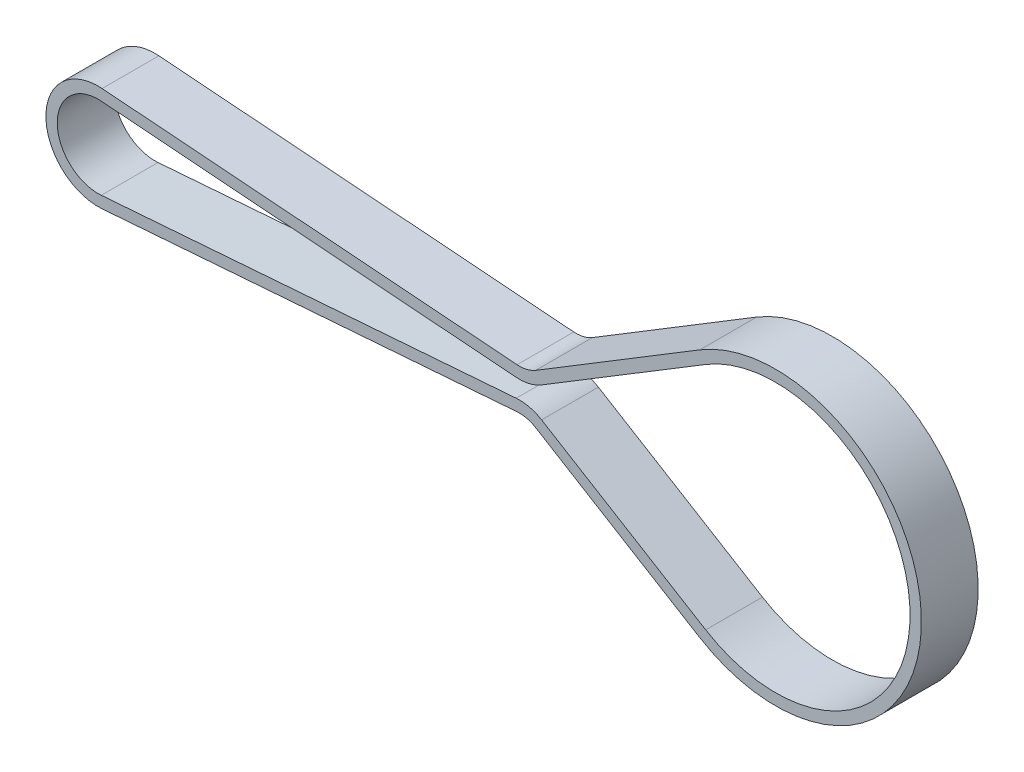
ISO-10303-21;
HEADER;
FILE_DESCRIPTION(('STEP AP214'),'2;1');
FILE_NAME('part.step','',(''),(''),'','','');
FILE_SCHEMA(('AUTOMOTIVE_DESIGN { 1 0 10303 214 1 1 1 1 }'));
ENDSEC;
DATA;
#1=APPLICATION_CONTEXT('core data for automotive mechanical design processes');
#2=APPLICATION_PROTOCOL_DEFINITION('international standard','automotive_design',2000,#1);
#3=PRODUCT_CONTEXT('',#1,'mechanical');
#4=PRODUCT('Part','Part','',(#3));
#5=PRODUCT_RELATED_PRODUCT_CATEGORY('part','',(#4));
#6=PRODUCT_DEFINITION_FORMATION('','',#4);
#7=PRODUCT_DEFINITION_CONTEXT('part definition',#1,'design');
#8=PRODUCT_DEFINITION('design','',#6,#7);
#9=PRODUCT_DEFINITION_SHAPE('','',#8);
#10=(LENGTH_UNIT() NAMED_UNIT(*) SI_UNIT(.MILLI.,.METRE.));
#11=(NAMED_UNIT(*) PLANE_ANGLE_UNIT() SI_UNIT($,.RADIAN.));
#12=(NAMED_UNIT(*) SI_UNIT($,.STERADIAN.) SOLID_ANGLE_UNIT());
#13=UNCERTAINTY_MEASURE_WITH_UNIT(LENGTH_MEASURE(1.E-05),#10,'distance_accuracy_value','');
#14=(GEOMETRIC_REPRESENTATION_CONTEXT(3) GLOBAL_UNCERTAINTY_ASSIGNED_CONTEXT((#13)) GLOBAL_UNIT_ASSIGNED_CONTEXT((#10,
#11,#12)) REPRESENTATION_CONTEXT('',''));
#15=CARTESIAN_POINT('',(0.,0.,0.));
#16=DIRECTION('',(0.,0.,1.));
#17=DIRECTION('',(1.,0.,0.));
#18=AXIS2_PLACEMENT_3D('',#15,#16,#17);
#19=CARTESIAN_POINT('',(0.,0.,184.33580348087));
#20=DIRECTION('',(0.,0.,-1.));
#21=DIRECTION('',(-1.,0.,0.));
#22=AXIS2_PLACEMENT_3D('',#19,#20,#21);
#23=CYLINDRICAL_SURFACE('',#22,10.125);
#24=DIRECTION('',(0.,0.,-1.));
#25=VECTOR('',#24,1.);
#26=CARTESIAN_POINT('',(0.771900540171762,-10.0955333963136,184.33580348087));
#27=LINE('',#26,#25);
#28=CARTESIAN_POINT('',(0.77190054017176,-10.0955333963136,5.50000000000009));
#29=VERTEX_POINT('',#28);
#30=CARTESIAN_POINT('',(0.771900540171774,-10.0955333963136,-5.49999999999994));
#31=VERTEX_POINT('',#30);
#32=EDGE_CURVE('E269',#29,#31,#27,.T.);
#33=ORIENTED_EDGE('',*,*,#32,.F.);
#34=CARTESIAN_POINT('',(0.,0.,5.50000000000009));
#35=DIRECTION('',(0.,0.,-1.));
#36=DIRECTION('',(-1.,0.,0.));
#37=AXIS2_PLACEMENT_3D('',#34,#35,#36);
#38=CIRCLE('',#37,10.125);
#39=CARTESIAN_POINT('',(0.771872033854974,10.0955355758549,5.50000000000009));
#40=VERTEX_POINT('',#39);
#41=EDGE_CURVE('E149',#29,#40,#38,.T.);
#42=ORIENTED_EDGE('',*,*,#41,.T.);
#43=DIRECTION('',(0.,0.,-1.));
#44=VECTOR('',#43,1.);
#45=CARTESIAN_POINT('',(0.771872033854974,10.0955355758549,184.33580348087));
#46=LINE('',#45,#44);
#47=CARTESIAN_POINT('',(0.771872033854974,10.0955355758549,-5.49999999999995));
#48=VERTEX_POINT('',#47);
#49=EDGE_CURVE('E281',#40,#48,#46,.T.);
#50=ORIENTED_EDGE('',*,*,#49,.T.);
#51=CARTESIAN_POINT('',(0.,0.,-5.49999999999995));
#52=DIRECTION('',(0.,0.,1.));
#53=DIRECTION('',(1.,0.,0.));
#54=AXIS2_PLACEMENT_3D('',#51,#52,#53);
#55=CIRCLE('',#54,10.125);
#56=EDGE_CURVE('E336',#31,#48,#55,.F.);
#57=ORIENTED_EDGE('',*,*,#56,.F.);
#58=EDGE_LOOP('',(#33,#42,#50,#57));
#59=FACE_BOUND('',#58,.T.);
#60=ADVANCED_FACE('F130',(#59),#23,.T.);
#61=CARTESIAN_POINT('',(81.178641225283,-3.94766541036326,184.33580348087));
#62=DIRECTION('',(-0.0762370903873346,0.997089718154426,0.));
#63=DIRECTION('',(-0.997089718154426,-0.0762370903873346,0.));
#64=AXIS2_PLACEMENT_3D('',#61,#62,#63);
#65=PLANE('',#64);
#66=DIRECTION('',(0.,0.,-1.));
#67=VECTOR('',#66,1.);
#68=CARTESIAN_POINT('',(81.178641225283,-3.94766541036326,184.33580348087));
#69=LINE('',#68,#67);
#70=CARTESIAN_POINT('',(81.178641225283,-3.94766541036326,5.50000000000006));
#71=VERTEX_POINT('',#70);
#72=CARTESIAN_POINT('',(81.178641225283,-3.94766541036326,-5.49999999999995));
#73=VERTEX_POINT('',#72);
#74=EDGE_CURVE('E229',#71,#73,#69,.T.);
#75=ORIENTED_EDGE('',*,*,#74,.F.);
#76=DIRECTION('',(-0.997089718154426,-0.0762370903873346,0.));
#77=VECTOR('',#76,1.);
#78=CARTESIAN_POINT('',(81.1786412252829,-3.94766541036327,5.50000000000006));
#79=LINE('',#78,#77);
#80=EDGE_CURVE('E272',#71,#29,#79,.T.);
#81=ORIENTED_EDGE('',*,*,#80,.T.);
#82=ORIENTED_EDGE('',*,*,#32,.T.);
#83=DIRECTION('',(-0.997089718154426,-0.0762370903873346,0.));
#84=VECTOR('',#83,1.);
#85=CARTESIAN_POINT('',(81.178641225283,-3.94766541036326,-5.49999999999998));
#86=LINE('',#85,#84);
#87=EDGE_CURVE('E304',#73,#31,#86,.T.);
#88=ORIENTED_EDGE('',*,*,#87,.F.);
#89=EDGE_LOOP('',(#75,#81,#82,#88));
#90=FACE_BOUND('',#89,.T.);
#91=ADVANCED_FACE('F408',(#90),#65,.F.);
#92=CARTESIAN_POINT('',(81.6414003639341,-9.99999999956063,184.33580348087));
#93=DIRECTION('',(0.,0.,-1.));
#94=DIRECTION('',(-1.,0.,0.));
#95=AXIS2_PLACEMENT_3D('',#92,#93,#94);
#96=CYLINDRICAL_SURFACE('',#95,6.07);
#97=DIRECTION('',(0.,0.,-1.));
#98=VECTOR('',#97,1.);
#99=CARTESIAN_POINT('',(84.7954679342819,-4.81379158091023,184.33580348087));
#100=LINE('',#99,#98);
#101=CARTESIAN_POINT('',(84.7954679342819,-4.81379158091023,5.50000000000007));
#102=VERTEX_POINT('',#101);
#103=CARTESIAN_POINT('',(84.7954679342819,-4.81379158091023,-5.49999999999998));
#104=VERTEX_POINT('',#103);
#105=EDGE_CURVE('E228',#102,#104,#100,.T.);
#106=ORIENTED_EDGE('',*,*,#105,.F.);
#107=CARTESIAN_POINT('',(81.6414003639341,-9.99999999956063,5.50000000000006));
#108=DIRECTION('',(0.,0.,-1.));
#109=DIRECTION('',(-1.,0.,0.));
#110=AXIS2_PLACEMENT_3D('',#107,#108,#109);
#111=CIRCLE('',#110,6.07);
#112=EDGE_CURVE('E224',#102,#71,#111,.F.);
#113=ORIENTED_EDGE('',*,*,#112,.T.);
#114=ORIENTED_EDGE('',*,*,#74,.T.);
#115=CARTESIAN_POINT('',(81.6414003639341,-9.99999999956063,-5.49999999999998));
#116=DIRECTION('',(0.,0.,1.));
#117=DIRECTION('',(1.,0.,0.));
#118=AXIS2_PLACEMENT_3D('',#115,#116,#117);
#119=CIRCLE('',#118,6.07);
#120=EDGE_CURVE('E313',#104,#73,#119,.T.);
#121=ORIENTED_EDGE('',*,*,#120,.F.);
#122=EDGE_LOOP('',(#106,#113,#114,#121));
#123=FACE_BOUND('',#122,.T.);
#124=ADVANCED_FACE('F307',(#123),#96,.F.);
#125=CARTESIAN_POINT('',(116.589214662106,-24.1496179494494,184.33580348087));
#126=DIRECTION('',(0.519615744703098,0.854400068970412,0.));
#127=DIRECTION('',(-0.854400068970412,0.519615744703098,0.));
#128=AXIS2_PLACEMENT_3D('',#125,#126,#127);
#129=PLANE('',#128);
#130=DIRECTION('',(0.,0.,-1.));
#131=VECTOR('',#130,1.);
#132=CARTESIAN_POINT('',(116.589214662106,-24.1496179494494,184.33580348087));
#133=LINE('',#132,#131);
#134=CARTESIAN_POINT('',(116.589214662106,-24.1496179494494,5.50000000000004));
#135=VERTEX_POINT('',#134);
#136=CARTESIAN_POINT('',(116.589214662106,-24.1496179494494,-5.49999999999998));
#137=VERTEX_POINT('',#136);
#138=EDGE_CURVE('E233',#135,#137,#133,.T.);
#139=ORIENTED_EDGE('',*,*,#138,.F.);
#140=DIRECTION('',(-0.854400068970412,0.519615744703098,0.));
#141=VECTOR('',#140,1.);
#142=CARTESIAN_POINT('',(116.589214662106,-24.1496179494494,5.50000000000006));
#143=LINE('',#142,#141);
#144=EDGE_CURVE('E218',#135,#102,#143,.T.);
#145=ORIENTED_EDGE('',*,*,#144,.T.);
#146=ORIENTED_EDGE('',*,*,#105,.T.);
#147=DIRECTION('',(-0.854400068970412,0.519615744703098,0.));
#148=VECTOR('',#147,1.);
#149=CARTESIAN_POINT('',(116.589214662106,-24.1496179494495,-5.49999999999998));
#150=LINE('',#149,#148);
#151=EDGE_CURVE('E237',#137,#104,#150,.T.);
#152=ORIENTED_EDGE('',*,*,#151,.F.);
#153=EDGE_LOOP('',(#139,#145,#146,#152));
#154=FACE_BOUND('',#153,.T.);
#155=ADVANCED_FACE('F234',(#154),#129,.F.);
#156=CARTESIAN_POINT('',(131.276153686139,-7.42461647718073E-13,184.33580348087));
#157=DIRECTION('',(0.,0.,-1.));
#158=DIRECTION('',(-1.,0.,0.));
#159=AXIS2_PLACEMENT_3D('',#156,#157,#158);
#160=CYLINDRICAL_SURFACE('',#159,28.265);
#161=DIRECTION('',(0.,0.,-1.));
#162=VECTOR('',#161,1.);
#163=CARTESIAN_POINT('',(116.589341289467,24.1496949592523,184.33580348087));
#164=LINE('',#163,#162);
#165=CARTESIAN_POINT('',(116.589341289467,24.1496949592523,5.50000000000004));
#166=VERTEX_POINT('',#165);
#167=CARTESIAN_POINT('',(116.589341289467,24.1496949592523,-5.50000000000001));
#168=VERTEX_POINT('',#167);
#169=EDGE_CURVE('E244',#166,#168,#164,.T.);
#170=ORIENTED_EDGE('',*,*,#169,.F.);
#171=CARTESIAN_POINT('',(131.276153686139,-7.42461647718073E-13,5.50000000000003));
#172=DIRECTION('',(0.,0.,-1.));
#173=DIRECTION('',(-1.,0.,0.));
#174=AXIS2_PLACEMENT_3D('',#171,#172,#173);
#175=CIRCLE('',#174,28.265);
#176=EDGE_CURVE('E221',#166,#135,#175,.T.);
#177=ORIENTED_EDGE('',*,*,#176,.T.);
#178=ORIENTED_EDGE('',*,*,#138,.T.);
#179=CARTESIAN_POINT('',(131.276153686139,-7.42461647718073E-13,-5.50000000000001));
#180=DIRECTION('',(0.,0.,1.));
#181=DIRECTION('',(1.,0.,0.));
#182=AXIS2_PLACEMENT_3D('',#179,#180,#181);
#183=CIRCLE('',#182,28.265);
#184=EDGE_CURVE('E323',#168,#137,#183,.F.);
#185=ORIENTED_EDGE('',*,*,#184,.F.);
#186=EDGE_LOOP('',(#170,#177,#178,#185));
#187=FACE_BOUND('',#186,.T.);
#188=ADVANCED_FACE('F242',(#187),#160,.T.);
#189=CARTESIAN_POINT('',(84.7954407409378,4.81400341107514,184.33580348087));
#190=DIRECTION('',(0.519611264697388,-0.854402793534513,0.));
#191=DIRECTION('',(0.854402793534514,0.519611264697388,0.));
#192=AXIS2_PLACEMENT_3D('',#189,#190,#191);
#193=PLANE('',#192);
#194=DIRECTION('',(0.,0.,-1.));
#195=VECTOR('',#194,1.);
#196=CARTESIAN_POINT('',(84.7954407409378,4.81400341107514,184.33580348087));
#197=LINE('',#196,#195);
#198=CARTESIAN_POINT('',(84.7954407409378,4.81400341107514,5.50000000000006));
#199=VERTEX_POINT('',#198);
#200=CARTESIAN_POINT('',(84.7954407409378,4.81400341107514,-5.49999999999998));
#201=VERTEX_POINT('',#200);
#202=EDGE_CURVE('E251',#199,#201,#197,.T.);
#203=ORIENTED_EDGE('',*,*,#202,.F.);
#204=DIRECTION('',(0.854402793534514,0.519611264697388,0.));
#205=VECTOR('',#204,1.);
#206=CARTESIAN_POINT('',(84.7954407409378,4.8140034110751,5.50000000000006));
#207=LINE('',#206,#205);
#208=EDGE_CURVE('E166',#199,#166,#207,.T.);
#209=ORIENTED_EDGE('',*,*,#208,.T.);
#210=ORIENTED_EDGE('',*,*,#169,.T.);
#211=DIRECTION('',(0.854402793534513,0.519611264697388,0.));
#212=VECTOR('',#211,1.);
#213=CARTESIAN_POINT('',(84.7954407409379,4.81400341107518,-5.49999999999998));
#214=LINE('',#213,#212);
#215=EDGE_CURVE('E325',#201,#168,#214,.T.);
#216=ORIENTED_EDGE('',*,*,#215,.F.);
#217=EDGE_LOOP('',(#203,#209,#210,#216));
#218=FACE_BOUND('',#217,.T.);
#219=ADVANCED_FACE('F436',(#218),#193,.F.);
#220=CARTESIAN_POINT('',(81.6414003642247,10.0002283678296,184.33580348087));
#221=DIRECTION('',(0.,0.,-1.));
#222=DIRECTION('',(-1.,0.,0.));
#223=AXIS2_PLACEMENT_3D('',#220,#221,#222);
#224=CYLINDRICAL_SURFACE('',#223,6.07);
#225=DIRECTION('',(0.,0.,-1.));
#226=VECTOR('',#225,1.);
#227=CARTESIAN_POINT('',(81.1786583152865,3.94789247198377,184.33580348087));
#228=LINE('',#227,#226);
#229=CARTESIAN_POINT('',(81.1786583152865,3.94789247198377,5.50000000000006));
#230=VERTEX_POINT('',#229);
#231=CARTESIAN_POINT('',(81.1786583152865,3.94789247198377,-5.49999999999998));
#232=VERTEX_POINT('',#231);
#233=EDGE_CURVE('E255',#230,#232,#228,.T.);
#234=ORIENTED_EDGE('',*,*,#233,.F.);
#235=CARTESIAN_POINT('',(81.6414003642247,10.0002283678296,5.50000000000006));
#236=DIRECTION('',(0.,0.,-1.));
#237=DIRECTION('',(-1.,0.,0.));
#238=AXIS2_PLACEMENT_3D('',#235,#236,#237);
#239=CIRCLE('',#238,6.07);
#240=EDGE_CURVE('E160',#230,#199,#239,.F.);
#241=ORIENTED_EDGE('',*,*,#240,.T.);
#242=ORIENTED_EDGE('',*,*,#202,.T.);
#243=CARTESIAN_POINT('',(81.6414003642247,10.0002283678296,-5.49999999999998));
#244=DIRECTION('',(0.,0.,1.));
#245=DIRECTION('',(1.,0.,0.));
#246=AXIS2_PLACEMENT_3D('',#243,#244,#245);
#247=CIRCLE('',#246,6.07);
#248=EDGE_CURVE('E331',#232,#201,#247,.T.);
#249=ORIENTED_EDGE('',*,*,#248,.F.);
#250=EDGE_LOOP('',(#234,#241,#242,#249));
#251=FACE_BOUND('',#250,.T.);
#252=ADVANCED_FACE('F432',(#251),#224,.F.);
#253=CARTESIAN_POINT('',(0.771872033854974,10.0955355758549,184.33580348087));
#254=DIRECTION('',(-0.0762342749486395,-0.997089933417771,0.));
#255=DIRECTION('',(0.997089933417771,-0.0762342749486395,0.));
#256=AXIS2_PLACEMENT_3D('',#253,#254,#255);
#257=PLANE('',#256);
#258=ORIENTED_EDGE('',*,*,#49,.F.);
#259=DIRECTION('',(0.997089933417771,-0.0762342749486395,0.));
#260=VECTOR('',#259,1.);
#261=CARTESIAN_POINT('',(0.771872033854909,10.095535575855,5.50000000000009));
#262=LINE('',#261,#260);
#263=EDGE_CURVE('E252',#40,#230,#262,.T.);
#264=ORIENTED_EDGE('',*,*,#263,.T.);
#265=ORIENTED_EDGE('',*,*,#233,.T.);
#266=DIRECTION('',(0.997089933417771,-0.0762342749486395,0.));
#267=VECTOR('',#266,1.);
#268=CARTESIAN_POINT('',(0.77187203385504,10.0955355758549,-5.49999999999995));
#269=LINE('',#268,#267);
#270=EDGE_CURVE('E334',#48,#232,#269,.T.);
#271=ORIENTED_EDGE('',*,*,#270,.F.);
#272=EDGE_LOOP('',(#258,#264,#265,#271));
#273=FACE_BOUND('',#272,.T.);
#274=ADVANCED_FACE('F429',(#273),#257,.F.);
#275=CARTESIAN_POINT('',(0.,0.,184.33580348087));
#276=DIRECTION('',(0.,0.,-1.));
#277=DIRECTION('',(-1.,0.,0.));
#278=AXIS2_PLACEMENT_3D('',#275,#276,#277);
#279=CYLINDRICAL_SURFACE('',#278,7.925);
#280=CARTESIAN_POINT('',(0.,0.,5.50000000000009));
#281=DIRECTION('',(0.,0.,-1.));
#282=DIRECTION('',(-1.,0.,0.));
#283=AXIS2_PLACEMENT_3D('',#280,#281,#282);
#284=CIRCLE('',#283,7.925);
#285=CARTESIAN_POINT('',(0.604178941319602,-7.90193601637382,5.50000000000009));
#286=VERTEX_POINT('',#285);
#287=CARTESIAN_POINT('',(0.604156628967968,7.90193772233585,5.50000000000006));
#288=VERTEX_POINT('',#287);
#289=EDGE_CURVE('E197',#286,#288,#284,.T.);
#290=ORIENTED_EDGE('',*,*,#289,.F.);
#291=DIRECTION('',(0.,0.,-1.));
#292=VECTOR('',#291,1.);
#293=CARTESIAN_POINT('',(0.604178941319602,-7.90193601637382,184.33580348087));
#294=LINE('',#293,#292);
#295=CARTESIAN_POINT('',(0.604178941319602,-7.90193601637382,-5.49999999999998));
#296=VERTEX_POINT('',#295);
#297=EDGE_CURVE('E280',#286,#296,#294,.T.);
#298=ORIENTED_EDGE('',*,*,#297,.T.);
#299=CARTESIAN_POINT('',(0.,0.,-5.49999999999995));
#300=DIRECTION('',(0.,0.,1.));
#301=DIRECTION('',(1.,0.,0.));
#302=AXIS2_PLACEMENT_3D('',#299,#300,#301);
#303=CIRCLE('',#302,7.925);
#304=CARTESIAN_POINT('',(0.604156628967968,7.90193772233585,-5.49999999999995));
#305=VERTEX_POINT('',#304);
#306=EDGE_CURVE('E337',#296,#305,#303,.F.);
#307=ORIENTED_EDGE('',*,*,#306,.T.);
#308=DIRECTION('',(0.,0.,-1.));
#309=VECTOR('',#308,1.);
#310=CARTESIAN_POINT('',(0.604156628967968,7.90193772233585,184.33580348087));
#311=LINE('',#310,#309);
#312=EDGE_CURVE('E256',#288,#305,#311,.T.);
#313=ORIENTED_EDGE('',*,*,#312,.F.);
#314=EDGE_LOOP('',(#290,#298,#307,#313));
#315=FACE_BOUND('',#314,.T.);
#316=ADVANCED_FACE('F382',(#315),#279,.F.);
#317=CARTESIAN_POINT('',(0.604178941319627,-7.90193601637382,184.33580348087));
#318=DIRECTION('',(-0.0762370903873346,0.997089718154426,0.));
#319=DIRECTION('',(-0.997089718154426,-0.0762370903873346,0.));
#320=AXIS2_PLACEMENT_3D('',#317,#318,#319);
#321=PLANE('',#320);
#322=DIRECTION('',(-0.997089718154426,-0.0762370903873346,0.));
#323=VECTOR('',#322,1.);
#324=CARTESIAN_POINT('',(0.604178941319555,-7.90193601637382,5.50000000000009));
#325=LINE('',#324,#323);
#326=CARTESIAN_POINT('',(81.0109196264308,-1.75406803042352,5.50000000000006));
#327=VERTEX_POINT('',#326);
#328=EDGE_CURVE('E12',#327,#286,#325,.T.);
#329=ORIENTED_EDGE('',*,*,#328,.F.);
#330=DIRECTION('',(0.,0.,-1.));
#331=VECTOR('',#330,1.);
#332=CARTESIAN_POINT('',(81.0109196264308,-1.75406803042352,184.33580348087));
#333=LINE('',#332,#331);
#334=CARTESIAN_POINT('',(81.0109196264308,-1.75406803042352,-5.49999999999998));
#335=VERTEX_POINT('',#334);
#336=EDGE_CURVE('E206',#327,#335,#333,.T.);
#337=ORIENTED_EDGE('',*,*,#336,.T.);
#338=DIRECTION('',(-0.997089718154426,-0.0762370903873346,0.));
#339=VECTOR('',#338,1.);
#340=CARTESIAN_POINT('',(0.604178941319699,-7.90193601637381,-5.49999999999995));
#341=LINE('',#340,#339);
#342=EDGE_CURVE('E267',#335,#296,#341,.T.);
#343=ORIENTED_EDGE('',*,*,#342,.T.);
#344=ORIENTED_EDGE('',*,*,#297,.F.);
#345=EDGE_LOOP('',(#329,#337,#343,#344));
#346=FACE_BOUND('',#345,.T.);
#347=ADVANCED_FACE('F385',(#346),#321,.T.);
#348=CARTESIAN_POINT('',(81.6414003639341,-9.99999999956063,184.33580348087));
#349=DIRECTION('',(0.,0.,-1.));
#350=DIRECTION('',(-1.,0.,0.));
#351=AXIS2_PLACEMENT_3D('',#348,#349,#350);
#352=CYLINDRICAL_SURFACE('',#351,8.27);
#353=CARTESIAN_POINT('',(81.6414003639341,-9.99999999956063,5.50000000000006));
#354=DIRECTION('',(0.,0.,-1.));
#355=DIRECTION('',(-1.,0.,0.));
#356=AXIS2_PLACEMENT_3D('',#353,#354,#355);
#357=CIRCLE('',#356,8.27);
#358=CARTESIAN_POINT('',(85.9386225726287,-2.93411142917531,5.50000000000004));
#359=VERTEX_POINT('',#358);
#360=EDGE_CURVE('E140',#359,#327,#357,.F.);
#361=ORIENTED_EDGE('',*,*,#360,.F.);
#362=DIRECTION('',(0.,0.,-1.));
#363=VECTOR('',#362,1.);
#364=CARTESIAN_POINT('',(85.9386225726287,-2.93411142917532,184.33580348087));
#365=LINE('',#364,#363);
#366=CARTESIAN_POINT('',(85.9386225726287,-2.93411142917532,-5.49999999999998));
#367=VERTEX_POINT('',#366);
#368=EDGE_CURVE('E287',#359,#367,#365,.T.);
#369=ORIENTED_EDGE('',*,*,#368,.T.);
#370=CARTESIAN_POINT('',(81.6414003639341,-9.99999999956063,-5.49999999999998));
#371=DIRECTION('',(0.,0.,1.));
#372=DIRECTION('',(1.,0.,0.));
#373=AXIS2_PLACEMENT_3D('',#370,#371,#372);
#374=CIRCLE('',#373,8.27);
#375=EDGE_CURVE('E351',#367,#335,#374,.T.);
#376=ORIENTED_EDGE('',*,*,#375,.T.);
#377=ORIENTED_EDGE('',*,*,#336,.F.);
#378=EDGE_LOOP('',(#361,#369,#376,#377));
#379=FACE_BOUND('',#378,.T.);
#380=ADVANCED_FACE('F480',(#379),#352,.T.);
#381=CARTESIAN_POINT('',(21.9008456545422,36.0113877004306,184.33580348087));
#382=DIRECTION('',(0.519615744703098,0.854400068970412,0.));
#383=DIRECTION('',(-0.854400068970412,0.519615744703098,0.));
#384=AXIS2_PLACEMENT_3D('',#381,#382,#383);
#385=PLANE('',#384);
#386=DIRECTION('',(-0.854400068970412,0.519615744703098,0.));
#387=VECTOR('',#386,1.);
#388=CARTESIAN_POINT('',(21.9008456545422,36.0113877004306,5.50000000000006));
#389=LINE('',#388,#387);
#390=CARTESIAN_POINT('',(117.732369300452,-22.2699377977145,5.50000000000004));
#391=VERTEX_POINT('',#390);
#392=EDGE_CURVE('E259',#391,#359,#389,.T.);
#393=ORIENTED_EDGE('',*,*,#392,.F.);
#394=DIRECTION('',(0.,0.,-1.));
#395=VECTOR('',#394,1.);
#396=CARTESIAN_POINT('',(117.732369300452,-22.2699377977145,184.33580348087));
#397=LINE('',#396,#395);
#398=CARTESIAN_POINT('',(117.732369300452,-22.2699377977145,-5.5));
#399=VERTEX_POINT('',#398);
#400=EDGE_CURVE('E289',#391,#399,#397,.T.);
#401=ORIENTED_EDGE('',*,*,#400,.T.);
#402=DIRECTION('',(-0.854400068970412,0.519615744703098,0.));
#403=VECTOR('',#402,1.);
#404=CARTESIAN_POINT('',(21.9008456545422,36.0113877004305,-5.49999999999998));
#405=LINE('',#404,#403);
#406=EDGE_CURVE('E353',#399,#367,#405,.T.);
#407=ORIENTED_EDGE('',*,*,#406,.T.);
#408=ORIENTED_EDGE('',*,*,#368,.F.);
#409=EDGE_LOOP('',(#393,#401,#407,#408));
#410=FACE_BOUND('',#409,.T.);
#411=ADVANCED_FACE('F391',(#410),#385,.T.);
#412=CARTESIAN_POINT('',(131.276153686139,-7.42461647718073E-13,184.33580348087));
#413=DIRECTION('',(0.,0.,-1.));
#414=DIRECTION('',(-1.,0.,0.));
#415=AXIS2_PLACEMENT_3D('',#412,#413,#414);
#416=CYLINDRICAL_SURFACE('',#415,26.065);
#417=CARTESIAN_POINT('',(131.276153686139,-7.42461647718073E-13,5.50000000000003));
#418=DIRECTION('',(0.,0.,-1.));
#419=DIRECTION('',(-1.,0.,0.));
#420=AXIS2_PLACEMENT_3D('',#417,#418,#419);
#421=CIRCLE('',#420,26.065);
#422=CARTESIAN_POINT('',(117.732486071801,22.2700088134763,5.50000000000004));
#423=VERTEX_POINT('',#422);
#424=EDGE_CURVE('E261',#423,#391,#421,.T.);
#425=ORIENTED_EDGE('',*,*,#424,.F.);
#426=DIRECTION('',(0.,0.,-1.));
#427=VECTOR('',#426,1.);
#428=CARTESIAN_POINT('',(117.732486071801,22.2700088134764,184.33580348087));
#429=LINE('',#428,#427);
#430=CARTESIAN_POINT('',(117.732486071801,22.2700088134764,-5.50000000000001));
#431=VERTEX_POINT('',#430);
#432=EDGE_CURVE('E292',#423,#431,#429,.T.);
#433=ORIENTED_EDGE('',*,*,#432,.T.);
#434=CARTESIAN_POINT('',(131.276153686139,-7.42461647718073E-13,-5.50000000000001));
#435=DIRECTION('',(0.,0.,1.));
#436=DIRECTION('',(1.,0.,0.));
#437=AXIS2_PLACEMENT_3D('',#434,#435,#436);
#438=CIRCLE('',#437,26.065);
#439=EDGE_CURVE('E358',#431,#399,#438,.F.);
#440=ORIENTED_EDGE('',*,*,#439,.T.);
#441=ORIENTED_EDGE('',*,*,#400,.F.);
#442=EDGE_LOOP('',(#425,#433,#440,#441));
#443=FACE_BOUND('',#442,.T.);
#444=ADVANCED_FACE('F394',(#443),#416,.F.);
#445=CARTESIAN_POINT('',(21.9003512378665,-36.0110000461933,184.33580348087));
#446=DIRECTION('',(0.519611264697388,-0.854402793534513,0.));
#447=DIRECTION('',(0.854402793534514,0.519611264697388,0.));
#448=AXIS2_PLACEMENT_3D('',#445,#446,#447);
#449=PLANE('',#448);
#450=DIRECTION('',(0.854402793534514,0.519611264697388,0.));
#451=VECTOR('',#450,1.);
#452=CARTESIAN_POINT('',(21.9003512378665,-36.0110000461933,5.50000000000009));
#453=LINE('',#452,#451);
#454=CARTESIAN_POINT('',(85.9385855232721,2.93431726529921,5.50000000000006));
#455=VERTEX_POINT('',#454);
#456=EDGE_CURVE('E262',#455,#423,#453,.T.);
#457=ORIENTED_EDGE('',*,*,#456,.F.);
#458=DIRECTION('',(0.,0.,-1.));
#459=VECTOR('',#458,1.);
#460=CARTESIAN_POINT('',(85.9385855232721,2.93431726529921,184.33580348087));
#461=LINE('',#460,#459);
#462=CARTESIAN_POINT('',(85.9385855232721,2.93431726529921,-5.49999999999998));
#463=VERTEX_POINT('',#462);
#464=EDGE_CURVE('E295',#455,#463,#461,.T.);
#465=ORIENTED_EDGE('',*,*,#464,.T.);
#466=DIRECTION('',(0.854402793534513,0.519611264697388,0.));
#467=VECTOR('',#466,1.);
#468=CARTESIAN_POINT('',(21.9003512378666,-36.0110000461933,-5.49999999999995));
#469=LINE('',#468,#467);
#470=EDGE_CURVE('E363',#463,#431,#469,.T.);
#471=ORIENTED_EDGE('',*,*,#470,.T.);
#472=ORIENTED_EDGE('',*,*,#432,.F.);
#473=EDGE_LOOP('',(#457,#465,#471,#472));
#474=FACE_BOUND('',#473,.T.);
#475=ADVANCED_FACE('F398',(#474),#449,.T.);
#476=CARTESIAN_POINT('',(81.6414003642247,10.0002283678296,184.33580348087));
#477=DIRECTION('',(0.,0.,-1.));
#478=DIRECTION('',(-1.,0.,0.));
#479=AXIS2_PLACEMENT_3D('',#476,#477,#478);
#480=CYLINDRICAL_SURFACE('',#479,8.27);
#481=CARTESIAN_POINT('',(81.6414003642247,10.0002283678296,5.50000000000006));
#482=DIRECTION('',(0.,0.,-1.));
#483=DIRECTION('',(-1.,0.,0.));
#484=AXIS2_PLACEMENT_3D('',#481,#482,#483);
#485=CIRCLE('',#484,8.27);
#486=CARTESIAN_POINT('',(81.0109429103995,1.75429461846467,5.50000000000006));
#487=VERTEX_POINT('',#486);
#488=EDGE_CURVE('E134',#487,#455,#485,.F.);
#489=ORIENTED_EDGE('',*,*,#488,.F.);
#490=DIRECTION('',(0.,0.,-1.));
#491=VECTOR('',#490,1.);
#492=CARTESIAN_POINT('',(81.0109429103995,1.75429461846467,184.33580348087));
#493=LINE('',#492,#491);
#494=CARTESIAN_POINT('',(81.0109429103995,1.75429461846467,-5.49999999999998));
#495=VERTEX_POINT('',#494);
#496=EDGE_CURVE('E298',#487,#495,#493,.T.);
#497=ORIENTED_EDGE('',*,*,#496,.T.);
#498=CARTESIAN_POINT('',(81.6414003642247,10.0002283678296,-5.49999999999998));
#499=DIRECTION('',(0.,0.,1.));
#500=DIRECTION('',(1.,0.,0.));
#501=AXIS2_PLACEMENT_3D('',#498,#499,#500);
#502=CIRCLE('',#501,8.27);
#503=EDGE_CURVE('E348',#495,#463,#502,.T.);
#504=ORIENTED_EDGE('',*,*,#503,.T.);
#505=ORIENTED_EDGE('',*,*,#464,.F.);
#506=EDGE_LOOP('',(#489,#497,#504,#505));
#507=FACE_BOUND('',#506,.T.);
#508=ADVANCED_FACE('F370',(#507),#480,.T.);
#509=CARTESIAN_POINT('',(0.604156628967968,7.90193772233585,184.33580348087));
#510=DIRECTION('',(-0.0762342749486394,-0.997089933417771,0.));
#511=DIRECTION('',(0.997089933417771,-0.0762342749486395,0.));
#512=AXIS2_PLACEMENT_3D('',#509,#510,#511);
#513=PLANE('',#512);
#514=DIRECTION('',(0.997089933417771,-0.0762342749486395,0.));
#515=VECTOR('',#514,1.);
#516=CARTESIAN_POINT('',(0.604156628967902,7.90193772233586,5.50000000000009));
#517=LINE('',#516,#515);
#518=EDGE_CURVE('E194',#288,#487,#517,.T.);
#519=ORIENTED_EDGE('',*,*,#518,.F.);
#520=ORIENTED_EDGE('',*,*,#312,.T.);
#521=DIRECTION('',(0.997089933417771,-0.0762342749486395,0.));
#522=VECTOR('',#521,1.);
#523=CARTESIAN_POINT('',(0.604156628968033,7.90193772233585,-5.49999999999995));
#524=LINE('',#523,#522);
#525=EDGE_CURVE('E342',#305,#495,#524,.T.);
#526=ORIENTED_EDGE('',*,*,#525,.T.);
#527=ORIENTED_EDGE('',*,*,#496,.F.);
#528=EDGE_LOOP('',(#519,#520,#526,#527));
#529=FACE_BOUND('',#528,.T.);
#530=ADVANCED_FACE('F380',(#529),#513,.T.);
#531=CARTESIAN_POINT('',(0.,0.,5.50000000000008));
#532=DIRECTION('',(0.,0.,-1.));
#533=DIRECTION('',(-0.629923921947863,-0.776656843501571,0.));
#534=AXIS2_PLACEMENT_3D('',#531,#532,#533);
#535=PLANE('',#534);
#536=ORIENTED_EDGE('',*,*,#289,.T.);
#537=ORIENTED_EDGE('',*,*,#518,.T.);
#538=ORIENTED_EDGE('',*,*,#488,.T.);
#539=ORIENTED_EDGE('',*,*,#456,.T.);
#540=ORIENTED_EDGE('',*,*,#424,.T.);
#541=ORIENTED_EDGE('',*,*,#392,.T.);
#542=ORIENTED_EDGE('',*,*,#360,.T.);
#543=ORIENTED_EDGE('',*,*,#328,.T.);
#544=EDGE_LOOP('',(#536,#537,#538,#539,#540,#541,#542,#543));
#545=FACE_BOUND('',#544,.T.);
#546=ORIENTED_EDGE('',*,*,#80,.F.);
#547=ORIENTED_EDGE('',*,*,#112,.F.);
#548=ORIENTED_EDGE('',*,*,#144,.F.);
#549=ORIENTED_EDGE('',*,*,#176,.F.);
#550=ORIENTED_EDGE('',*,*,#208,.F.);
#551=ORIENTED_EDGE('',*,*,#240,.F.);
#552=ORIENTED_EDGE('',*,*,#263,.F.);
#553=ORIENTED_EDGE('',*,*,#41,.F.);
#554=EDGE_LOOP('',(#546,#547,#548,#549,#550,#551,#552,#553));
#555=FACE_BOUND('',#554,.T.);
#556=ADVANCED_FACE('F132',(#545,#555),#535,.F.);
#557=CARTESIAN_POINT('',(0.,0.,-5.49999999999994));
#558=DIRECTION('',(0.,0.,1.));
#559=DIRECTION('',(0.629923921947863,0.776656843501571,0.));
#560=AXIS2_PLACEMENT_3D('',#557,#558,#559);
#561=PLANE('',#560);
#562=ORIENTED_EDGE('',*,*,#56,.T.);
#563=ORIENTED_EDGE('',*,*,#270,.T.);
#564=ORIENTED_EDGE('',*,*,#248,.T.);
#565=ORIENTED_EDGE('',*,*,#215,.T.);
#566=ORIENTED_EDGE('',*,*,#184,.T.);
#567=ORIENTED_EDGE('',*,*,#151,.T.);
#568=ORIENTED_EDGE('',*,*,#120,.T.);
#569=ORIENTED_EDGE('',*,*,#87,.T.);
#570=EDGE_LOOP('',(#562,#563,#564,#565,#566,#567,#568,#569));
#571=FACE_BOUND('',#570,.T.);
#572=ORIENTED_EDGE('',*,*,#342,.F.);
#573=ORIENTED_EDGE('',*,*,#375,.F.);
#574=ORIENTED_EDGE('',*,*,#406,.F.);
#575=ORIENTED_EDGE('',*,*,#439,.F.);
#576=ORIENTED_EDGE('',*,*,#470,.F.);
#577=ORIENTED_EDGE('',*,*,#503,.F.);
#578=ORIENTED_EDGE('',*,*,#525,.F.);
#579=ORIENTED_EDGE('',*,*,#306,.F.);
#580=EDGE_LOOP('',(#572,#573,#574,#575,#576,#577,#578,#579));
#581=FACE_BOUND('',#580,.T.);
#582=ADVANCED_FACE('F318',(#571,#581),#561,.F.);
#583=CLOSED_SHELL('',(#60,#91,#124,#155,#188,#219,#252,#274,#316,#347,#380,#411,#444,#475,#508,
#530,#556,#582));
#584=MANIFOLD_SOLID_BREP('B2',#583);
#585=ADVANCED_BREP_SHAPE_REPRESENTATION('',(#18,#584),#14);
#586=SHAPE_DEFINITION_REPRESENTATION(#9,#585);
ENDSEC;
END-ISO-10303-21;
